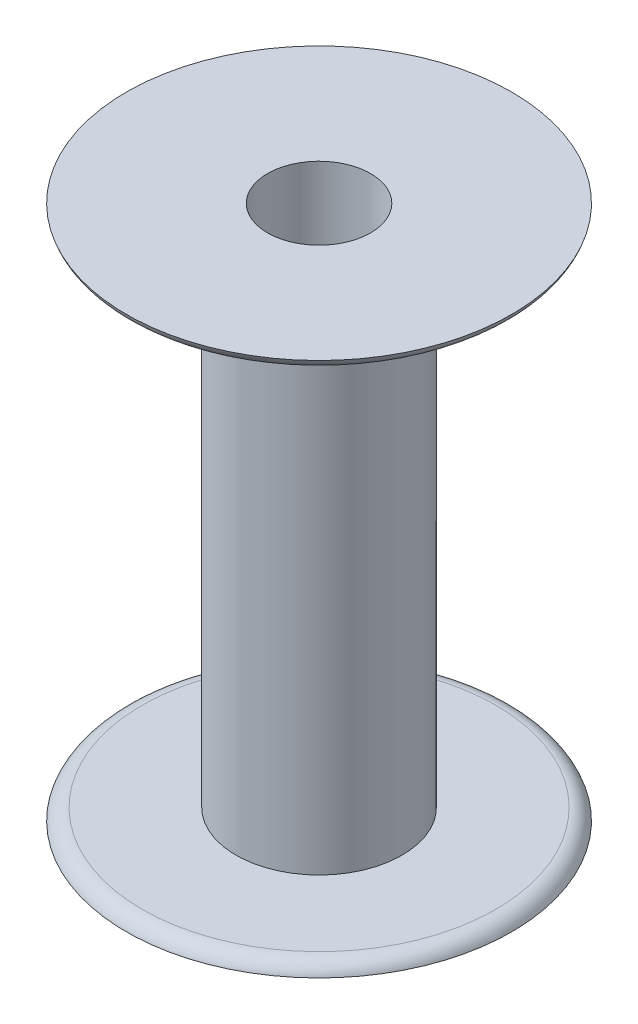
ISO-10303-21;
HEADER;
FILE_DESCRIPTION(('STEP AP214'),'2;1');
FILE_NAME('part.step','',(''),(''),'','','');
FILE_SCHEMA(('AUTOMOTIVE_DESIGN { 1 0 10303 214 1 1 1 1 }'));
ENDSEC;
DATA;
#1=APPLICATION_CONTEXT('core data for automotive mechanical design processes');
#2=APPLICATION_PROTOCOL_DEFINITION('international standard','automotive_design',2000,#1);
#3=PRODUCT_CONTEXT('',#1,'mechanical');
#4=PRODUCT('Part','Part','',(#3));
#5=PRODUCT_RELATED_PRODUCT_CATEGORY('part','',(#4));
#6=PRODUCT_DEFINITION_FORMATION('','',#4);
#7=PRODUCT_DEFINITION_CONTEXT('part definition',#1,'design');
#8=PRODUCT_DEFINITION('design','',#6,#7);
#9=PRODUCT_DEFINITION_SHAPE('','',#8);
#10=(LENGTH_UNIT() NAMED_UNIT(*) SI_UNIT(.MILLI.,.METRE.));
#11=(NAMED_UNIT(*) PLANE_ANGLE_UNIT() SI_UNIT($,.RADIAN.));
#12=(NAMED_UNIT(*) SI_UNIT($,.STERADIAN.) SOLID_ANGLE_UNIT());
#13=UNCERTAINTY_MEASURE_WITH_UNIT(LENGTH_MEASURE(1.E-05),#10,'distance_accuracy_value','');
#14=(GEOMETRIC_REPRESENTATION_CONTEXT(3) GLOBAL_UNCERTAINTY_ASSIGNED_CONTEXT((#13)) GLOBAL_UNIT_ASSIGNED_CONTEXT((#10,
#11,#12)) REPRESENTATION_CONTEXT('',''));
#15=CARTESIAN_POINT('',(0.,0.,0.));
#16=DIRECTION('',(0.,0.,1.));
#17=DIRECTION('',(1.,0.,0.));
#18=AXIS2_PLACEMENT_3D('',#15,#16,#17);
#19=CARTESIAN_POINT('',(0.,16.1,0.));
#20=DIRECTION('',(0.,1.,0.));
#21=DIRECTION('',(0.,0.,1.));
#22=AXIS2_PLACEMENT_3D('',#19,#20,#21);
#23=PLANE('',#22);
#24=CARTESIAN_POINT('',(0.,16.1,0.));
#25=DIRECTION('',(0.,1.,0.));
#26=DIRECTION('',(0.,0.,1.));
#27=AXIS2_PLACEMENT_3D('',#24,#25,#26);
#28=CIRCLE('',#27,3.1);
#29=CARTESIAN_POINT('',(0.,16.1,3.1));
#30=VERTEX_POINT('',#29);
#31=EDGE_CURVE('E64',#30,#30,#28,.T.);
#32=ORIENTED_EDGE('',*,*,#31,.F.);
#33=EDGE_LOOP('',(#32));
#34=FACE_BOUND('',#33,.T.);
#35=CARTESIAN_POINT('',(0.,16.1,0.));
#36=DIRECTION('',(0.,-1.,0.));
#37=DIRECTION('',(0.,0.,-1.));
#38=AXIS2_PLACEMENT_3D('',#35,#36,#37);
#39=CIRCLE('',#38,11.6);
#40=CARTESIAN_POINT('',(0.,16.1,-11.6));
#41=VERTEX_POINT('',#40);
#42=EDGE_CURVE('E48',#41,#41,#39,.T.);
#43=ORIENTED_EDGE('',*,*,#42,.F.);
#44=EDGE_LOOP('',(#43));
#45=FACE_BOUND('',#44,.T.);
#46=ADVANCED_FACE('F37',(#34,#45),#23,.T.);
#47=CARTESIAN_POINT('',(11.6,15.4,0.));
#48=DIRECTION('',(0.,-1.,0.));
#49=DIRECTION('',(0.,0.,-1.));
#50=AXIS2_PLACEMENT_3D('',#47,#48,#49);
#51=PLANE('',#50);
#52=CARTESIAN_POINT('',(0.,15.4,0.));
#53=DIRECTION('',(0.,-1.,0.));
#54=DIRECTION('',(0.,0.,-1.));
#55=AXIS2_PLACEMENT_3D('',#52,#53,#54);
#56=CIRCLE('',#55,10.6460607985831);
#57=CARTESIAN_POINT('',(0.,15.4,-10.6460607985831));
#58=VERTEX_POINT('',#57);
#59=EDGE_CURVE('E10',#58,#58,#56,.T.);
#60=ORIENTED_EDGE('',*,*,#59,.T.);
#61=EDGE_LOOP('',(#60));
#62=FACE_BOUND('',#61,.T.);
#63=CARTESIAN_POINT('',(0.,15.4,0.));
#64=DIRECTION('',(0.,-1.,0.));
#65=DIRECTION('',(0.,0.,-1.));
#66=AXIS2_PLACEMENT_3D('',#63,#64,#65);
#67=CIRCLE('',#66,5.);
#68=CARTESIAN_POINT('',(0.,15.4,-5.));
#69=VERTEX_POINT('',#68);
#70=EDGE_CURVE('E52',#69,#69,#67,.T.);
#71=ORIENTED_EDGE('',*,*,#70,.F.);
#72=EDGE_LOOP('',(#71));
#73=FACE_BOUND('',#72,.T.);
#74=ADVANCED_FACE('F83',(#62,#73),#51,.T.);
#75=CARTESIAN_POINT('',(0.,24.3586161135711,0.));
#76=DIRECTION('',(0.,-1.,0.));
#77=DIRECTION('',(0.,0.,-1.));
#78=AXIS2_PLACEMENT_3D('',#75,#76,#77);
#79=CYLINDRICAL_SURFACE('',#78,5.);
#80=ORIENTED_EDGE('',*,*,#70,.T.);
#81=EDGE_LOOP('',(#80));
#82=FACE_BOUND('',#81,.T.);
#83=CARTESIAN_POINT('',(0.,-15.4,0.));
#84=DIRECTION('',(0.,-1.,0.));
#85=DIRECTION('',(0.,0.,-1.));
#86=AXIS2_PLACEMENT_3D('',#83,#84,#85);
#87=CIRCLE('',#86,5.);
#88=CARTESIAN_POINT('',(0.,-15.4,-5.));
#89=VERTEX_POINT('',#88);
#90=EDGE_CURVE('E60',#89,#89,#87,.T.);
#91=ORIENTED_EDGE('',*,*,#90,.F.);
#92=EDGE_LOOP('',(#91));
#93=FACE_BOUND('',#92,.T.);
#94=ADVANCED_FACE('F100',(#82,#93),#79,.T.);
#95=CARTESIAN_POINT('',(0.,-16.1,0.));
#96=DIRECTION('',(0.,-1.,0.));
#97=DIRECTION('',(0.,0.,1.));
#98=AXIS2_PLACEMENT_3D('',#95,#96,#97);
#99=PLANE('',#98);
#100=CARTESIAN_POINT('',(0.,-16.1,0.));
#101=DIRECTION('',(0.,1.,0.));
#102=DIRECTION('',(0.,0.,1.));
#103=AXIS2_PLACEMENT_3D('',#100,#101,#102);
#104=CIRCLE('',#103,3.1);
#105=CARTESIAN_POINT('',(0.,-16.1,3.1));
#106=VERTEX_POINT('',#105);
#107=EDGE_CURVE('E63',#106,#106,#104,.T.);
#108=ORIENTED_EDGE('',*,*,#107,.T.);
#109=EDGE_LOOP('',(#108));
#110=FACE_BOUND('',#109,.T.);
#111=CARTESIAN_POINT('',(0.,-16.1,0.));
#112=DIRECTION('',(0.,-1.,0.));
#113=DIRECTION('',(0.,0.,-1.));
#114=AXIS2_PLACEMENT_3D('',#111,#112,#113);
#115=CIRCLE('',#114,11.6);
#116=CARTESIAN_POINT('',(0.,-16.1,-11.6));
#117=VERTEX_POINT('',#116);
#118=EDGE_CURVE('E57',#117,#117,#115,.T.);
#119=ORIENTED_EDGE('',*,*,#118,.T.);
#120=EDGE_LOOP('',(#119));
#121=FACE_BOUND('',#120,.T.);
#122=ADVANCED_FACE('F70',(#110,#121),#99,.T.);
#123=CARTESIAN_POINT('',(11.6,-15.4,0.));
#124=DIRECTION('',(0.,1.,0.));
#125=DIRECTION('',(0.,0.,-1.));
#126=AXIS2_PLACEMENT_3D('',#123,#124,#125);
#127=PLANE('',#126);
#128=CARTESIAN_POINT('',(0.,-15.4,0.));
#129=DIRECTION('',(0.,1.,0.));
#130=DIRECTION('',(0.,0.,1.));
#131=AXIS2_PLACEMENT_3D('',#128,#129,#130);
#132=CIRCLE('',#131,10.6460607985831);
#133=CARTESIAN_POINT('',(0.,-15.4,10.6460607985831));
#134=VERTEX_POINT('',#133);
#135=EDGE_CURVE('E44',#134,#134,#132,.T.);
#136=ORIENTED_EDGE('',*,*,#135,.T.);
#137=EDGE_LOOP('',(#136));
#138=FACE_BOUND('',#137,.T.);
#139=ORIENTED_EDGE('',*,*,#90,.T.);
#140=EDGE_LOOP('',(#139));
#141=FACE_BOUND('',#140,.T.);
#142=ADVANCED_FACE('F77',(#138,#141),#127,.T.);
#143=CARTESIAN_POINT('',(0.,-16.1,0.));
#144=DIRECTION('',(0.,1.,0.));
#145=DIRECTION('',(0.,0.,1.));
#146=AXIS2_PLACEMENT_3D('',#143,#144,#145);
#147=CYLINDRICAL_SURFACE('',#146,3.1);
#148=ORIENTED_EDGE('',*,*,#107,.F.);
#149=EDGE_LOOP('',(#148));
#150=FACE_BOUND('',#149,.T.);
#151=ORIENTED_EDGE('',*,*,#31,.T.);
#152=EDGE_LOOP('',(#151));
#153=FACE_BOUND('',#152,.T.);
#154=ADVANCED_FACE('F73',(#150,#153),#147,.F.);
#155=CARTESIAN_POINT('',(0.,-16.4,0.));
#156=DIRECTION('',(0.,-1.,0.));
#157=DIRECTION('',(0.,0.,-1.));
#158=AXIS2_PLACEMENT_3D('',#155,#156,#157);
#159=TOROIDAL_SURFACE('',#158,10.6460607985831,1.);
#160=ORIENTED_EDGE('',*,*,#135,.F.);
#161=EDGE_LOOP('',(#160));
#162=FACE_BOUND('',#161,.T.);
#163=ORIENTED_EDGE('',*,*,#118,.F.);
#164=EDGE_LOOP('',(#163));
#165=FACE_BOUND('',#164,.T.);
#166=ADVANCED_FACE('F76',(#162,#165),#159,.T.);
#167=CARTESIAN_POINT('',(0.,16.4,0.));
#168=DIRECTION('',(0.,1.,0.));
#169=DIRECTION('',(0.,0.,1.));
#170=AXIS2_PLACEMENT_3D('',#167,#168,#169);
#171=TOROIDAL_SURFACE('',#170,10.6460607985831,1.);
#172=ORIENTED_EDGE('',*,*,#42,.T.);
#173=EDGE_LOOP('',(#172));
#174=FACE_BOUND('',#173,.T.);
#175=ORIENTED_EDGE('',*,*,#59,.F.);
#176=EDGE_LOOP('',(#175));
#177=FACE_BOUND('',#176,.T.);
#178=ADVANCED_FACE('F39',(#174,#177),#171,.T.);
#179=CLOSED_SHELL('',(#46,#74,#94,#122,#142,#154,#166,#178));
#180=MANIFOLD_SOLID_BREP('B2',#179);
#181=ADVANCED_BREP_SHAPE_REPRESENTATION('',(#18,#180),#14);
#182=SHAPE_DEFINITION_REPRESENTATION(#9,#181);
ENDSEC;
END-ISO-10303-21;
